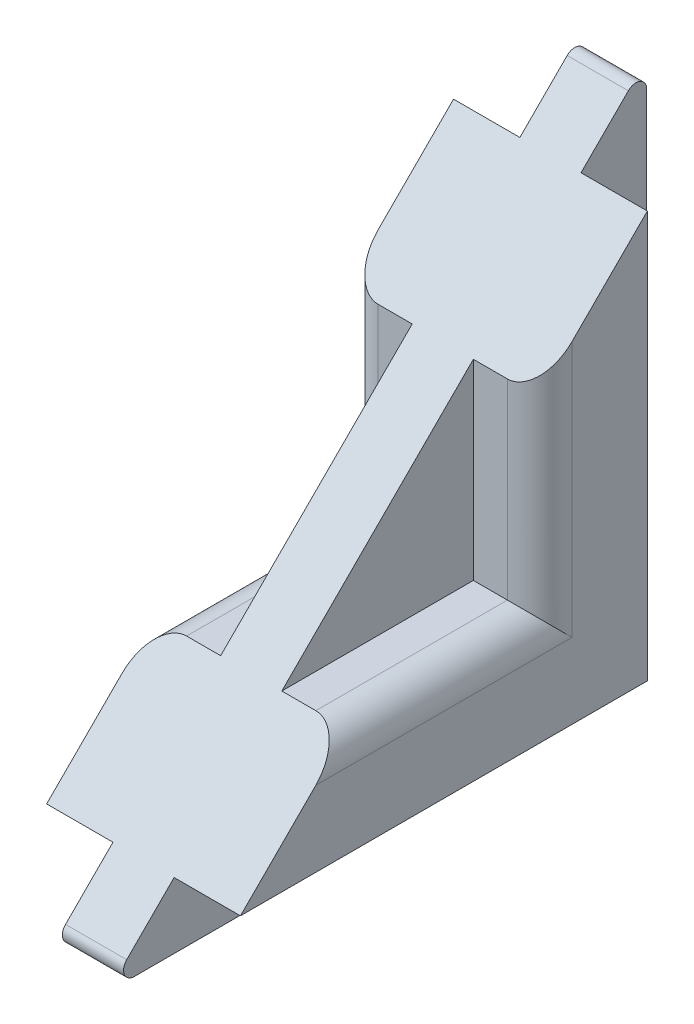
ISO-10303-21;
HEADER;
FILE_DESCRIPTION(('STEP AP214'),'2;1');
FILE_NAME('part.step','',(''),(''),'','','');
FILE_SCHEMA(('AUTOMOTIVE_DESIGN { 1 0 10303 214 1 1 1 1 }'));
ENDSEC;
DATA;
#1=APPLICATION_CONTEXT('core data for automotive mechanical design processes');
#2=APPLICATION_PROTOCOL_DEFINITION('international standard','automotive_design',2000,#1);
#3=PRODUCT_CONTEXT('',#1,'mechanical');
#4=PRODUCT('Part','Part','',(#3));
#5=PRODUCT_RELATED_PRODUCT_CATEGORY('part','',(#4));
#6=PRODUCT_DEFINITION_FORMATION('','',#4);
#7=PRODUCT_DEFINITION_CONTEXT('part definition',#1,'design');
#8=PRODUCT_DEFINITION('design','',#6,#7);
#9=PRODUCT_DEFINITION_SHAPE('','',#8);
#10=(LENGTH_UNIT() NAMED_UNIT(*) SI_UNIT(.MILLI.,.METRE.));
#11=(NAMED_UNIT(*) PLANE_ANGLE_UNIT() SI_UNIT($,.RADIAN.));
#12=(NAMED_UNIT(*) SI_UNIT($,.STERADIAN.) SOLID_ANGLE_UNIT());
#13=UNCERTAINTY_MEASURE_WITH_UNIT(LENGTH_MEASURE(1.E-05),#10,'distance_accuracy_value','');
#14=(GEOMETRIC_REPRESENTATION_CONTEXT(3) GLOBAL_UNCERTAINTY_ASSIGNED_CONTEXT((#13)) GLOBAL_UNIT_ASSIGNED_CONTEXT((#10,
#11,#12)) REPRESENTATION_CONTEXT('',''));
#15=CARTESIAN_POINT('',(0.,0.,0.));
#16=DIRECTION('',(0.,0.,1.));
#17=DIRECTION('',(1.,0.,0.));
#18=AXIS2_PLACEMENT_3D('',#15,#16,#17);
#19=CARTESIAN_POINT('',(-2.84,0.,0.));
#20=DIRECTION('',(1.,0.,0.));
#21=DIRECTION('',(0.,0.,-1.));
#22=AXIS2_PLACEMENT_3D('',#19,#20,#21);
#23=PLANE('',#22);
#24=DIRECTION('',(0.,0.707106781186548,-0.707106781186547));
#25=VECTOR('',#24,1.);
#26=CARTESIAN_POINT('',(-2.84,3.9,1.));
#27=LINE('',#26,#25);
#28=CARTESIAN_POINT('',(-2.84,47.8,-42.9));
#29=VERTEX_POINT('',#28);
#30=CARTESIAN_POINT('',(-2.84,52.1928932188134,-47.2928932188134));
#31=VERTEX_POINT('',#30);
#32=EDGE_CURVE('E231',#29,#31,#27,.T.);
#33=ORIENTED_EDGE('',*,*,#32,.T.);
#34=CARTESIAN_POINT('',(-2.84,51.4857864376269,-48.));
#35=DIRECTION('',(1.,0.,0.));
#36=DIRECTION('',(0.,0.,-1.));
#37=AXIS2_PLACEMENT_3D('',#34,#35,#36);
#38=CIRCLE('',#37,1.);
#39=CARTESIAN_POINT('',(-2.84,51.4857864376269,-49.));
#40=VERTEX_POINT('',#39);
#41=EDGE_CURVE('E311',#31,#40,#38,.F.);
#42=ORIENTED_EDGE('',*,*,#41,.T.);
#43=DIRECTION('',(0.,-1.,0.));
#44=VECTOR('',#43,1.);
#45=CARTESIAN_POINT('',(-2.84,53.9,-49.));
#46=LINE('',#45,#44);
#47=CARTESIAN_POINT('',(-2.84,10.0130093746648,-49.));
#48=VERTEX_POINT('',#47);
#49=EDGE_CURVE('E232',#40,#48,#46,.T.);
#50=ORIENTED_EDGE('',*,*,#49,.T.);
#51=DIRECTION('',(0.,0.,1.));
#52=VECTOR('',#51,1.);
#53=CARTESIAN_POINT('',(-2.84,10.0130093746648,-49.0001030776406));
#54=LINE('',#53,#52);
#55=CARTESIAN_POINT('',(-2.84,10.0130093746648,-42.9));
#56=VERTEX_POINT('',#55);
#57=EDGE_CURVE('E239',#48,#56,#54,.T.);
#58=ORIENTED_EDGE('',*,*,#57,.T.);
#59=DIRECTION('',(0.,-1.,0.));
#60=VECTOR('',#59,1.);
#61=CARTESIAN_POINT('',(-2.84,20.0130093746648,-42.9));
#62=LINE('',#61,#60);
#63=EDGE_CURVE('E271',#29,#56,#62,.T.);
#64=ORIENTED_EDGE('',*,*,#63,.F.);
#65=EDGE_LOOP('',(#33,#42,#50,#58,#64));
#66=FACE_BOUND('',#65,.T.);
#67=ADVANCED_FACE('F63',(#66),#23,.F.);
#68=CARTESIAN_POINT('',(2.84,0.,0.));
#69=DIRECTION('',(1.,0.,0.));
#70=DIRECTION('',(0.,0.,-1.));
#71=AXIS2_PLACEMENT_3D('',#68,#69,#70);
#72=PLANE('',#71);
#73=DIRECTION('',(0.,-1.,0.));
#74=VECTOR('',#73,1.);
#75=CARTESIAN_POINT('',(2.84,53.9,-49.));
#76=LINE('',#75,#74);
#77=CARTESIAN_POINT('',(2.84,51.4857864376269,-49.));
#78=VERTEX_POINT('',#77);
#79=CARTESIAN_POINT('',(2.84,10.0130093746648,-49.));
#80=VERTEX_POINT('',#79);
#81=EDGE_CURVE('E224',#78,#80,#76,.T.);
#82=ORIENTED_EDGE('',*,*,#81,.F.);
#83=CARTESIAN_POINT('',(2.84,51.4857864376269,-48.));
#84=DIRECTION('',(1.,0.,0.));
#85=DIRECTION('',(0.,0.,-1.));
#86=AXIS2_PLACEMENT_3D('',#83,#84,#85);
#87=CIRCLE('',#86,1.);
#88=CARTESIAN_POINT('',(2.84,52.1928932188134,-47.2928932188134));
#89=VERTEX_POINT('',#88);
#90=EDGE_CURVE('E314',#78,#89,#87,.T.);
#91=ORIENTED_EDGE('',*,*,#90,.T.);
#92=DIRECTION('',(0.,0.707106781186548,-0.707106781186547));
#93=VECTOR('',#92,1.);
#94=CARTESIAN_POINT('',(2.84,3.9,1.));
#95=LINE('',#94,#93);
#96=CARTESIAN_POINT('',(2.84,47.8,-42.9));
#97=VERTEX_POINT('',#96);
#98=EDGE_CURVE('E356',#97,#89,#95,.T.);
#99=ORIENTED_EDGE('',*,*,#98,.F.);
#100=DIRECTION('',(0.,1.,0.));
#101=VECTOR('',#100,1.);
#102=CARTESIAN_POINT('',(2.84,20.0130093746648,-42.9));
#103=LINE('',#102,#101);
#104=CARTESIAN_POINT('',(2.84,10.0130093746648,-42.9));
#105=VERTEX_POINT('',#104);
#106=EDGE_CURVE('E237',#105,#97,#103,.T.);
#107=ORIENTED_EDGE('',*,*,#106,.F.);
#108=DIRECTION('',(0.,0.,1.));
#109=VECTOR('',#108,1.);
#110=CARTESIAN_POINT('',(2.84,10.0130093746648,-49.0001030776406));
#111=LINE('',#110,#109);
#112=EDGE_CURVE('E214',#80,#105,#111,.T.);
#113=ORIENTED_EDGE('',*,*,#112,.F.);
#114=EDGE_LOOP('',(#82,#91,#99,#107,#113));
#115=FACE_BOUND('',#114,.T.);
#116=ADVANCED_FACE('F235',(#115),#72,.T.);
#117=CARTESIAN_POINT('',(9.00000000000001,20.0130093746648,14.7428405448833));
#118=DIRECTION('',(1.,0.,0.));
#119=DIRECTION('',(0.,0.,-1.));
#120=AXIS2_PLACEMENT_3D('',#117,#118,#119);
#121=PLANE('',#120);
#122=DIRECTION('',(0.,-0.707106781186548,0.707106781186547));
#123=VECTOR('',#122,1.);
#124=CARTESIAN_POINT('',(9.00000000000001,57.727924959774,-52.827924959774));
#125=LINE('',#124,#123);
#126=CARTESIAN_POINT('',(9.00000000000001,47.8,-42.9));
#127=VERTEX_POINT('',#126);
#128=CARTESIAN_POINT('',(9.00000000000001,40.8,-35.9));
#129=VERTEX_POINT('',#128);
#130=EDGE_CURVE('E252',#127,#129,#125,.T.);
#131=ORIENTED_EDGE('',*,*,#130,.T.);
#132=DIRECTION('',(0.,-1.,0.));
#133=VECTOR('',#132,1.);
#134=CARTESIAN_POINT('',(9.00000000000001,20.0130093746648,-35.9));
#135=LINE('',#134,#133);
#136=CARTESIAN_POINT('',(9.00000000000001,17.0130093746648,-35.9));
#137=VERTEX_POINT('',#136);
#138=EDGE_CURVE('E403',#129,#137,#135,.T.);
#139=ORIENTED_EDGE('',*,*,#138,.T.);
#140=DIRECTION('',(0.,0.,-1.));
#141=VECTOR('',#140,1.);
#142=CARTESIAN_POINT('',(9.00000000000001,17.0130093746648,14.7428405448833));
#143=LINE('',#142,#141);
#144=CARTESIAN_POINT('',(9.00000000000001,17.0130093746648,-12.1130093746648));
#145=VERTEX_POINT('',#144);
#146=EDGE_CURVE('E393',#137,#145,#143,.F.);
#147=ORIENTED_EDGE('',*,*,#146,.T.);
#148=DIRECTION('',(0.,-0.707106781186548,0.707106781186547));
#149=VECTOR('',#148,1.);
#150=CARTESIAN_POINT('',(9.00000000000001,5.08508441489075,-0.185084414890751));
#151=LINE('',#150,#149);
#152=CARTESIAN_POINT('',(9.00000000000001,10.0130093746648,-5.11300937466477));
#153=VERTEX_POINT('',#152);
#154=EDGE_CURVE('E288',#145,#153,#151,.T.);
#155=ORIENTED_EDGE('',*,*,#154,.T.);
#156=DIRECTION('',(0.,0.,-1.));
#157=VECTOR('',#156,1.);
#158=CARTESIAN_POINT('',(9.00000000000001,10.0130093746648,14.7428405448833));
#159=LINE('',#158,#157);
#160=CARTESIAN_POINT('',(9.00000000000001,10.0130093746648,-42.9));
#161=VERTEX_POINT('',#160);
#162=EDGE_CURVE('E290',#153,#161,#159,.T.);
#163=ORIENTED_EDGE('',*,*,#162,.T.);
#164=DIRECTION('',(0.,-1.,0.));
#165=VECTOR('',#164,1.);
#166=CARTESIAN_POINT('',(9.00000000000001,20.0130093746648,-42.9));
#167=LINE('',#166,#165);
#168=EDGE_CURVE('E272',#127,#161,#167,.T.);
#169=ORIENTED_EDGE('',*,*,#168,.F.);
#170=EDGE_LOOP('',(#131,#139,#147,#155,#163,#169));
#171=FACE_BOUND('',#170,.T.);
#172=ADVANCED_FACE('F456',(#171),#121,.T.);
#173=CARTESIAN_POINT('',(-9.,20.0130093746648,14.7428405448833));
#174=DIRECTION('',(0.,1.,0.));
#175=DIRECTION('',(-1.,0.,0.));
#176=AXIS2_PLACEMENT_3D('',#173,#174,#175);
#177=PLANE('',#176);
#178=DIRECTION('',(1.,0.,0.));
#179=VECTOR('',#178,1.);
#180=CARTESIAN_POINT('',(-8.99999999999999,20.0130093746648,-15.1130093746648));
#181=LINE('',#180,#179);
#182=CARTESIAN_POINT('',(2.84,20.0130093746648,-15.1130093746648));
#183=VERTEX_POINT('',#182);
#184=CARTESIAN_POINT('',(6.00000000000001,20.0130093746648,-15.1130093746648));
#185=VERTEX_POINT('',#184);
#186=EDGE_CURVE('E293',#183,#185,#181,.T.);
#187=ORIENTED_EDGE('',*,*,#186,.T.);
#188=DIRECTION('',(0.,0.,-1.));
#189=VECTOR('',#188,1.);
#190=CARTESIAN_POINT('',(6.00000000000001,20.0130093746648,14.7428405448833));
#191=LINE('',#190,#189);
#192=CARTESIAN_POINT('',(6.00000000000001,20.0130093746648,-32.9));
#193=VERTEX_POINT('',#192);
#194=EDGE_CURVE('E390',#185,#193,#191,.T.);
#195=ORIENTED_EDGE('',*,*,#194,.T.);
#196=DIRECTION('',(1.,0.,0.));
#197=VECTOR('',#196,1.);
#198=CARTESIAN_POINT('',(-9.,20.0130093746648,-32.9));
#199=LINE('',#198,#197);
#200=CARTESIAN_POINT('',(2.84,20.0130093746648,-32.9));
#201=VERTEX_POINT('',#200);
#202=EDGE_CURVE('E263',#201,#193,#199,.T.);
#203=ORIENTED_EDGE('',*,*,#202,.F.);
#204=DIRECTION('',(0.,0.,1.));
#205=VECTOR('',#204,1.);
#206=CARTESIAN_POINT('',(2.84,20.0130093746648,0.));
#207=LINE('',#206,#205);
#208=EDGE_CURVE('E299',#201,#183,#207,.T.);
#209=ORIENTED_EDGE('',*,*,#208,.T.);
#210=EDGE_LOOP('',(#187,#195,#203,#209));
#211=FACE_BOUND('',#210,.T.);
#212=ADVANCED_FACE('F482',(#211),#177,.T.);
#213=CARTESIAN_POINT('',(9.00000000000001,10.0130093746648,14.7428405448833));
#214=DIRECTION('',(0.,-1.,0.));
#215=DIRECTION('',(0.,0.,-1.));
#216=AXIS2_PLACEMENT_3D('',#213,#214,#215);
#217=PLANE('',#216);
#218=DIRECTION('',(0.,0.,-1.));
#219=VECTOR('',#218,1.);
#220=CARTESIAN_POINT('',(2.84,10.0130093746648,0.));
#221=LINE('',#220,#219);
#222=CARTESIAN_POINT('',(2.84,10.0130093746648,-5.11300937466477));
#223=VERTEX_POINT('',#222);
#224=EDGE_CURVE('E304',#223,#105,#221,.T.);
#225=ORIENTED_EDGE('',*,*,#224,.T.);
#226=DIRECTION('',(-1.,0.,0.));
#227=VECTOR('',#226,1.);
#228=CARTESIAN_POINT('',(9.,10.0130093746648,-42.9));
#229=LINE('',#228,#227);
#230=EDGE_CURVE('E275',#161,#105,#229,.T.);
#231=ORIENTED_EDGE('',*,*,#230,.F.);
#232=ORIENTED_EDGE('',*,*,#162,.F.);
#233=DIRECTION('',(-1.,0.,0.));
#234=VECTOR('',#233,1.);
#235=CARTESIAN_POINT('',(9.00000000000001,10.0130093746648,-5.11300937466477));
#236=LINE('',#235,#234);
#237=EDGE_CURVE('E284',#153,#223,#236,.T.);
#238=ORIENTED_EDGE('',*,*,#237,.T.);
#239=EDGE_LOOP('',(#225,#231,#232,#238));
#240=FACE_BOUND('',#239,.T.);
#241=ADVANCED_FACE('F485',(#240),#217,.T.);
#242=DIRECTION('',(0.,0.,-1.));
#243=VECTOR('',#242,1.);
#244=CARTESIAN_POINT('',(-9.,10.0130093746648,14.7428405448833));
#245=LINE('',#244,#243);
#246=CARTESIAN_POINT('',(-9.,10.0130093746648,-5.11300937466477));
#247=VERTEX_POINT('',#246);
#248=CARTESIAN_POINT('',(-9.,10.0130093746648,-42.9));
#249=VERTEX_POINT('',#248);
#250=EDGE_CURVE('E287',#247,#249,#245,.T.);
#251=ORIENTED_EDGE('',*,*,#250,.T.);
#252=DIRECTION('',(1.,0.,0.));
#253=VECTOR('',#252,1.);
#254=CARTESIAN_POINT('',(9.00000000000001,10.0130093746648,-42.9));
#255=LINE('',#254,#253);
#256=EDGE_CURVE('E278',#249,#56,#255,.T.);
#257=ORIENTED_EDGE('',*,*,#256,.T.);
#258=DIRECTION('',(0.,0.,-1.));
#259=VECTOR('',#258,1.);
#260=CARTESIAN_POINT('',(-2.84,10.0130093746648,0.));
#261=LINE('',#260,#259);
#262=CARTESIAN_POINT('',(-2.84,10.0130093746648,-5.11300937466477));
#263=VERTEX_POINT('',#262);
#264=EDGE_CURVE('E330',#263,#56,#261,.T.);
#265=ORIENTED_EDGE('',*,*,#264,.F.);
#266=EDGE_CURVE('E283',#263,#247,#236,.T.);
#267=ORIENTED_EDGE('',*,*,#266,.T.);
#268=EDGE_LOOP('',(#251,#257,#265,#267));
#269=FACE_BOUND('',#268,.T.);
#270=ADVANCED_FACE('F341',(#269),#217,.T.);
#271=DIRECTION('',(1.,0.,0.));
#272=VECTOR('',#271,1.);
#273=CARTESIAN_POINT('',(-9.,20.0130093746648,-32.9));
#274=LINE('',#273,#272);
#275=CARTESIAN_POINT('',(-6.,20.0130093746648,-32.9));
#276=VERTEX_POINT('',#275);
#277=CARTESIAN_POINT('',(-2.84,20.0130093746648,-32.9));
#278=VERTEX_POINT('',#277);
#279=EDGE_CURVE('E269',#276,#278,#274,.T.);
#280=ORIENTED_EDGE('',*,*,#279,.F.);
#281=DIRECTION('',(0.,0.,-1.));
#282=VECTOR('',#281,1.);
#283=CARTESIAN_POINT('',(-6.,20.0130093746648,14.7428405448833));
#284=LINE('',#283,#282);
#285=CARTESIAN_POINT('',(-6.,20.0130093746648,-15.1130093746648));
#286=VERTEX_POINT('',#285);
#287=EDGE_CURVE('E399',#276,#286,#284,.F.);
#288=ORIENTED_EDGE('',*,*,#287,.T.);
#289=CARTESIAN_POINT('',(-2.84,20.0130093746648,-15.1130093746648));
#290=VERTEX_POINT('',#289);
#291=EDGE_CURVE('E291',#286,#290,#181,.T.);
#292=ORIENTED_EDGE('',*,*,#291,.T.);
#293=DIRECTION('',(0.,0.,1.));
#294=VECTOR('',#293,1.);
#295=CARTESIAN_POINT('',(-2.84,20.0130093746648,0.));
#296=LINE('',#295,#294);
#297=EDGE_CURVE('E301',#278,#290,#296,.T.);
#298=ORIENTED_EDGE('',*,*,#297,.F.);
#299=EDGE_LOOP('',(#280,#288,#292,#298));
#300=FACE_BOUND('',#299,.T.);
#301=ADVANCED_FACE('F436',(#300),#177,.T.);
#302=CARTESIAN_POINT('',(-9.,10.0130093746648,14.7428405448833));
#303=DIRECTION('',(-1.,0.,0.));
#304=DIRECTION('',(0.,0.,1.));
#305=AXIS2_PLACEMENT_3D('',#302,#303,#304);
#306=PLANE('',#305);
#307=DIRECTION('',(0.,0.,-1.));
#308=VECTOR('',#307,1.);
#309=CARTESIAN_POINT('',(-9.,17.0130093746648,14.7428405448833));
#310=LINE('',#309,#308);
#311=CARTESIAN_POINT('',(-9.,17.0130093746648,-12.1130093746648));
#312=VERTEX_POINT('',#311);
#313=CARTESIAN_POINT('',(-9.,17.0130093746648,-35.9));
#314=VERTEX_POINT('',#313);
#315=EDGE_CURVE('E397',#312,#314,#310,.T.);
#316=ORIENTED_EDGE('',*,*,#315,.T.);
#317=DIRECTION('',(0.,-1.,0.));
#318=VECTOR('',#317,1.);
#319=CARTESIAN_POINT('',(-9.,10.0130093746648,-35.9));
#320=LINE('',#319,#318);
#321=CARTESIAN_POINT('',(-9.,40.8,-35.9));
#322=VERTEX_POINT('',#321);
#323=EDGE_CURVE('E415',#314,#322,#320,.F.);
#324=ORIENTED_EDGE('',*,*,#323,.T.);
#325=DIRECTION('',(0.,0.707106781186548,-0.707106781186547));
#326=VECTOR('',#325,1.);
#327=CARTESIAN_POINT('',(-9.,57.727924959774,-52.827924959774));
#328=LINE('',#327,#326);
#329=CARTESIAN_POINT('',(-9.,47.8,-42.9));
#330=VERTEX_POINT('',#329);
#331=EDGE_CURVE('E253',#322,#330,#328,.T.);
#332=ORIENTED_EDGE('',*,*,#331,.T.);
#333=DIRECTION('',(0.,-1.,0.));
#334=VECTOR('',#333,1.);
#335=CARTESIAN_POINT('',(-9.,10.0130093746648,-42.9));
#336=LINE('',#335,#334);
#337=EDGE_CURVE('E348',#330,#249,#336,.T.);
#338=ORIENTED_EDGE('',*,*,#337,.T.);
#339=ORIENTED_EDGE('',*,*,#250,.F.);
#340=DIRECTION('',(0.,0.707106781186548,-0.707106781186547));
#341=VECTOR('',#340,1.);
#342=CARTESIAN_POINT('',(-9.,0.0850844148907511,4.81491558510925));
#343=LINE('',#342,#341);
#344=EDGE_CURVE('E294',#247,#312,#343,.T.);
#345=ORIENTED_EDGE('',*,*,#344,.T.);
#346=EDGE_LOOP('',(#316,#324,#332,#338,#339,#345));
#347=FACE_BOUND('',#346,.T.);
#348=ADVANCED_FACE('F346',(#347),#306,.T.);
#349=CARTESIAN_POINT('',(-2.84,37.8,-32.9));
#350=VERTEX_POINT('',#349);
#351=EDGE_CURVE('E362',#290,#350,#27,.T.);
#352=ORIENTED_EDGE('',*,*,#351,.T.);
#353=DIRECTION('',(0.,-1.,0.));
#354=VECTOR('',#353,1.);
#355=CARTESIAN_POINT('',(-2.84,0.,-32.9));
#356=LINE('',#355,#354);
#357=EDGE_CURVE('E266',#350,#278,#356,.T.);
#358=ORIENTED_EDGE('',*,*,#357,.T.);
#359=ORIENTED_EDGE('',*,*,#297,.T.);
#360=EDGE_LOOP('',(#352,#358,#359));
#361=FACE_BOUND('',#360,.T.);
#362=ADVANCED_FACE('F434',(#361),#23,.F.);
#363=DIRECTION('',(0.,-1.,0.));
#364=VECTOR('',#363,1.);
#365=CARTESIAN_POINT('',(2.84,0.,-32.9));
#366=LINE('',#365,#364);
#367=CARTESIAN_POINT('',(2.84,37.8,-32.9));
#368=VERTEX_POINT('',#367);
#369=EDGE_CURVE('E255',#368,#201,#366,.T.);
#370=ORIENTED_EDGE('',*,*,#369,.F.);
#371=EDGE_CURVE('E351',#183,#368,#95,.T.);
#372=ORIENTED_EDGE('',*,*,#371,.F.);
#373=ORIENTED_EDGE('',*,*,#208,.F.);
#374=EDGE_LOOP('',(#370,#372,#373));
#375=FACE_BOUND('',#374,.T.);
#376=ADVANCED_FACE('F458',(#375),#72,.T.);
#377=CARTESIAN_POINT('',(2.84,53.9,-49.));
#378=DIRECTION('',(0.,0.,-1.));
#379=DIRECTION('',(-1.,0.,0.));
#380=AXIS2_PLACEMENT_3D('',#377,#378,#379);
#381=PLANE('',#380);
#382=DIRECTION('',(0.000107994562990206,0.999999994168587,0.));
#383=VECTOR('',#382,1.);
#384=CARTESIAN_POINT('',(2.8447395563459,53.8999994881537,-49.));
#385=LINE('',#384,#383);
#386=CARTESIAN_POINT('',(2.8394478227838,4.9,-49.));
#387=VERTEX_POINT('',#386);
#388=EDGE_CURVE('E210',#387,#80,#385,.T.);
#389=ORIENTED_EDGE('',*,*,#388,.F.);
#390=DIRECTION('',(-1.,0.,0.));
#391=VECTOR('',#390,1.);
#392=CARTESIAN_POINT('',(2.84,4.9,-49.));
#393=LINE('',#392,#391);
#394=CARTESIAN_POINT('',(-2.8394478227838,4.9,-49.));
#395=VERTEX_POINT('',#394);
#396=EDGE_CURVE('E323',#387,#395,#393,.T.);
#397=ORIENTED_EDGE('',*,*,#396,.T.);
#398=DIRECTION('',(0.000107994562990064,-0.999999994168587,0.));
#399=VECTOR('',#398,1.);
#400=CARTESIAN_POINT('',(-2.84473949010104,53.8993860790395,-49.));
#401=LINE('',#400,#399);
#402=EDGE_CURVE('E246',#48,#395,#401,.T.);
#403=ORIENTED_EDGE('',*,*,#402,.F.);
#404=ORIENTED_EDGE('',*,*,#49,.F.);
#405=DIRECTION('',(-1.,0.,0.));
#406=VECTOR('',#405,1.);
#407=CARTESIAN_POINT('',(2.84,51.4857864376269,-49.));
#408=LINE('',#407,#406);
#409=EDGE_CURVE('E228',#40,#78,#408,.F.);
#410=ORIENTED_EDGE('',*,*,#409,.T.);
#411=ORIENTED_EDGE('',*,*,#81,.T.);
#412=EDGE_LOOP('',(#389,#397,#403,#404,#410,#411));
#413=FACE_BOUND('',#412,.T.);
#414=ADVANCED_FACE('F225',(#413),#381,.T.);
#415=CARTESIAN_POINT('',(2.84,3.9,1.));
#416=DIRECTION('',(0.,0.707106781186547,0.707106781186548));
#417=DIRECTION('',(0.,-0.707106781186548,0.707106781186547));
#418=AXIS2_PLACEMENT_3D('',#415,#416,#417);
#419=PLANE('',#418);
#420=ORIENTED_EDGE('',*,*,#98,.T.);
#421=DIRECTION('',(-1.,0.,0.));
#422=VECTOR('',#421,1.);
#423=CARTESIAN_POINT('',(2.84,52.1928932188134,-47.2928932188134));
#424=LINE('',#423,#422);
#425=EDGE_CURVE('E376',#89,#31,#424,.T.);
#426=ORIENTED_EDGE('',*,*,#425,.T.);
#427=ORIENTED_EDGE('',*,*,#32,.F.);
#428=DIRECTION('',(1.,0.,0.));
#429=VECTOR('',#428,1.);
#430=CARTESIAN_POINT('',(-9.,47.8,-42.9));
#431=LINE('',#430,#429);
#432=EDGE_CURVE('E249',#330,#29,#431,.T.);
#433=ORIENTED_EDGE('',*,*,#432,.F.);
#434=ORIENTED_EDGE('',*,*,#331,.F.);
#435=CARTESIAN_POINT('',(-6.,40.8,-35.9));
#436=DIRECTION('',(0.,0.707106781186547,0.707106781186548));
#437=DIRECTION('',(0.,-0.707106781186548,0.707106781186547));
#438=AXIS2_PLACEMENT_3D('',#435,#436,#437);
#439=ELLIPSE('',#438,4.24264068711929,3.);
#440=CARTESIAN_POINT('',(-6.,37.8,-32.9));
#441=VERTEX_POINT('',#440);
#442=EDGE_CURVE('E408',#322,#441,#439,.T.);
#443=ORIENTED_EDGE('',*,*,#442,.T.);
#444=DIRECTION('',(-1.,0.,0.));
#445=VECTOR('',#444,1.);
#446=CARTESIAN_POINT('',(-9.,37.8,-32.9));
#447=LINE('',#446,#445);
#448=EDGE_CURVE('E258',#350,#441,#447,.T.);
#449=ORIENTED_EDGE('',*,*,#448,.F.);
#450=ORIENTED_EDGE('',*,*,#351,.F.);
#451=ORIENTED_EDGE('',*,*,#291,.F.);
#452=CARTESIAN_POINT('',(-6.,17.0130093746648,-12.1130093746648));
#453=DIRECTION('',(0.,0.707106781186547,0.707106781186548));
#454=DIRECTION('',(0.,0.707106781186548,-0.707106781186547));
#455=AXIS2_PLACEMENT_3D('',#452,#453,#454);
#456=ELLIPSE('',#455,4.24264068711928,3.);
#457=EDGE_CURVE('E401',#286,#312,#456,.T.);
#458=ORIENTED_EDGE('',*,*,#457,.T.);
#459=ORIENTED_EDGE('',*,*,#344,.F.);
#460=ORIENTED_EDGE('',*,*,#266,.F.);
#461=DIRECTION('',(-7.63636880442273E-05,0.707106779124832,-0.707106779124832));
#462=VECTOR('',#461,1.);
#463=CARTESIAN_POINT('',(-2.83933982822214,3.90000001824534,0.999999981754665));
#464=LINE('',#463,#462);
#465=CARTESIAN_POINT('',(-2.83952418647206,5.60710678118654,-0.70710678118654));
#466=VERTEX_POINT('',#465);
#467=EDGE_CURVE('E220',#466,#263,#464,.T.);
#468=ORIENTED_EDGE('',*,*,#467,.F.);
#469=DIRECTION('',(-1.,0.,0.));
#470=VECTOR('',#469,1.);
#471=CARTESIAN_POINT('',(2.84,5.60710678118654,-0.707106781186541));
#472=LINE('',#471,#470);
#473=CARTESIAN_POINT('',(2.83952418647207,5.60710678118654,-0.707106781186538));
#474=VERTEX_POINT('',#473);
#475=EDGE_CURVE('E381',#466,#474,#472,.F.);
#476=ORIENTED_EDGE('',*,*,#475,.T.);
#477=DIRECTION('',(-7.63636880443277E-05,-0.707106779124832,0.707106779124832));
#478=VECTOR('',#477,1.);
#479=CARTESIAN_POINT('',(2.84,10.0130093746648,-5.11300937466477));
#480=LINE('',#479,#478);
#481=EDGE_CURVE('E221',#223,#474,#480,.T.);
#482=ORIENTED_EDGE('',*,*,#481,.F.);
#483=ORIENTED_EDGE('',*,*,#237,.F.);
#484=ORIENTED_EDGE('',*,*,#154,.F.);
#485=CARTESIAN_POINT('',(6.00000000000001,17.0130093746648,-12.1130093746648));
#486=DIRECTION('',(0.,0.707106781186547,0.707106781186548));
#487=DIRECTION('',(0.,0.707106781186548,-0.707106781186547));
#488=AXIS2_PLACEMENT_3D('',#485,#486,#487);
#489=ELLIPSE('',#488,4.24264068711928,3.);
#490=EDGE_CURVE('E395',#145,#185,#489,.T.);
#491=ORIENTED_EDGE('',*,*,#490,.T.);
#492=ORIENTED_EDGE('',*,*,#186,.F.);
#493=ORIENTED_EDGE('',*,*,#371,.T.);
#494=CARTESIAN_POINT('',(6.,37.8,-32.9));
#495=VERTEX_POINT('',#494);
#496=EDGE_CURVE('E256',#495,#368,#447,.T.);
#497=ORIENTED_EDGE('',*,*,#496,.F.);
#498=CARTESIAN_POINT('',(6.,40.8,-35.9));
#499=DIRECTION('',(0.,0.707106781186547,0.707106781186548));
#500=DIRECTION('',(0.,-0.707106781186548,0.707106781186547));
#501=AXIS2_PLACEMENT_3D('',#498,#499,#500);
#502=ELLIPSE('',#501,4.24264068711929,3.);
#503=EDGE_CURVE('E410',#495,#129,#502,.T.);
#504=ORIENTED_EDGE('',*,*,#503,.T.);
#505=ORIENTED_EDGE('',*,*,#130,.F.);
#506=EDGE_CURVE('E248',#97,#127,#431,.T.);
#507=ORIENTED_EDGE('',*,*,#506,.F.);
#508=EDGE_LOOP('',(#420,#426,#427,#433,#434,#443,#449,#450,#451,#458,#459,#460,#468,#476,#482,
#483,#484,#491,#492,#493,#497,#504,#505,#507));
#509=FACE_BOUND('',#508,.T.);
#510=ADVANCED_FACE('F375',(#509),#419,.T.);
#511=CARTESIAN_POINT('',(2.84,3.9,-49.));
#512=DIRECTION('',(0.,-1.,0.));
#513=DIRECTION('',(0.,0.,-1.));
#514=AXIS2_PLACEMENT_3D('',#511,#512,#513);
#515=PLANE('',#514);
#516=DIRECTION('',(0.,0.,1.));
#517=VECTOR('',#516,1.);
#518=CARTESIAN_POINT('',(-2.83933982822017,3.9,-49.));
#519=LINE('',#518,#517);
#520=CARTESIAN_POINT('',(-2.83933982822017,3.9,-48.));
#521=VERTEX_POINT('',#520);
#522=CARTESIAN_POINT('',(-2.83933982822017,3.9,-1.41421356237308));
#523=VERTEX_POINT('',#522);
#524=EDGE_CURVE('E353',#521,#523,#519,.T.);
#525=ORIENTED_EDGE('',*,*,#524,.F.);
#526=DIRECTION('',(-1.,0.,0.));
#527=VECTOR('',#526,1.);
#528=CARTESIAN_POINT('',(2.84,3.9,-48.));
#529=LINE('',#528,#527);
#530=CARTESIAN_POINT('',(2.83933982822018,3.9,-48.));
#531=VERTEX_POINT('',#530);
#532=EDGE_CURVE('E71',#521,#531,#529,.F.);
#533=ORIENTED_EDGE('',*,*,#532,.T.);
#534=DIRECTION('',(0.,0.,-1.));
#535=VECTOR('',#534,1.);
#536=CARTESIAN_POINT('',(2.83933982822018,3.9,-49.));
#537=LINE('',#536,#535);
#538=CARTESIAN_POINT('',(2.83933982822018,3.9,-1.41421356237308));
#539=VERTEX_POINT('',#538);
#540=EDGE_CURVE('E350',#539,#531,#537,.T.);
#541=ORIENTED_EDGE('',*,*,#540,.F.);
#542=DIRECTION('',(-1.,0.,0.));
#543=VECTOR('',#542,1.);
#544=CARTESIAN_POINT('',(2.84,3.9,-1.41421356237308));
#545=LINE('',#544,#543);
#546=EDGE_CURVE('E316',#539,#523,#545,.T.);
#547=ORIENTED_EDGE('',*,*,#546,.T.);
#548=EDGE_LOOP('',(#525,#533,#541,#547));
#549=FACE_BOUND('',#548,.T.);
#550=ADVANCED_FACE('F446',(#549),#515,.T.);
#551=CARTESIAN_POINT('',(0.,0.,-42.9));
#552=DIRECTION('',(0.,0.,-1.));
#553=DIRECTION('',(-1.,0.,0.));
#554=AXIS2_PLACEMENT_3D('',#551,#552,#553);
#555=PLANE('',#554);
#556=ORIENTED_EDGE('',*,*,#337,.F.);
#557=ORIENTED_EDGE('',*,*,#432,.T.);
#558=ORIENTED_EDGE('',*,*,#63,.T.);
#559=ORIENTED_EDGE('',*,*,#256,.F.);
#560=EDGE_LOOP('',(#556,#557,#558,#559));
#561=FACE_BOUND('',#560,.T.);
#562=ADVANCED_FACE('F336',(#561),#555,.T.);
#563=CARTESIAN_POINT('',(0.,0.,-42.9));
#564=DIRECTION('',(0.,0.,-1.));
#565=DIRECTION('',(-1.,0.,0.));
#566=AXIS2_PLACEMENT_3D('',#563,#564,#565);
#567=PLANE('',#566);
#568=ORIENTED_EDGE('',*,*,#168,.T.);
#569=ORIENTED_EDGE('',*,*,#230,.T.);
#570=ORIENTED_EDGE('',*,*,#106,.T.);
#571=ORIENTED_EDGE('',*,*,#506,.T.);
#572=EDGE_LOOP('',(#568,#569,#570,#571));
#573=FACE_BOUND('',#572,.T.);
#574=ADVANCED_FACE('F468',(#573),#567,.T.);
#575=CARTESIAN_POINT('',(-9.,67.655849919548,-32.9));
#576=DIRECTION('',(0.,0.,1.));
#577=DIRECTION('',(1.,0.,0.));
#578=AXIS2_PLACEMENT_3D('',#575,#576,#577);
#579=PLANE('',#578);
#580=ORIENTED_EDGE('',*,*,#202,.T.);
#581=DIRECTION('',(0.,-1.,0.));
#582=VECTOR('',#581,1.);
#583=CARTESIAN_POINT('',(6.,67.655849919548,-32.9));
#584=LINE('',#583,#582);
#585=EDGE_CURVE('E406',#193,#495,#584,.F.);
#586=ORIENTED_EDGE('',*,*,#585,.T.);
#587=ORIENTED_EDGE('',*,*,#496,.T.);
#588=ORIENTED_EDGE('',*,*,#369,.T.);
#589=EDGE_LOOP('',(#580,#586,#587,#588));
#590=FACE_BOUND('',#589,.T.);
#591=ADVANCED_FACE('F474',(#590),#579,.T.);
#592=ORIENTED_EDGE('',*,*,#448,.T.);
#593=DIRECTION('',(0.,-1.,0.));
#594=VECTOR('',#593,1.);
#595=CARTESIAN_POINT('',(-6.,67.655849919548,-32.9));
#596=LINE('',#595,#594);
#597=EDGE_CURVE('E412',#441,#276,#596,.T.);
#598=ORIENTED_EDGE('',*,*,#597,.T.);
#599=ORIENTED_EDGE('',*,*,#279,.T.);
#600=ORIENTED_EDGE('',*,*,#357,.F.);
#601=EDGE_LOOP('',(#592,#598,#599,#600));
#602=FACE_BOUND('',#601,.T.);
#603=ADVANCED_FACE('F431',(#602),#579,.T.);
#604=CARTESIAN_POINT('',(2.83933982822018,3.9,-49.0001030776406));
#605=DIRECTION('',(-0.999999994168587,0.000107994562990206,0.));
#606=DIRECTION('',(-0.000107994562990206,-0.999999994168587,0.));
#607=AXIS2_PLACEMENT_3D('',#604,#605,#606);
#608=PLANE('',#607);
#609=ORIENTED_EDGE('',*,*,#540,.T.);
#610=CARTESIAN_POINT('',(2.8394478227838,4.9,-48.));
#611=DIRECTION('',(-0.999999994168587,0.000107994562990206,0.));
#612=DIRECTION('',(-0.000107994562990206,-0.999999994168587,0.));
#613=AXIS2_PLACEMENT_3D('',#610,#611,#612);
#614=ELLIPSE('',#613,1.00000000583141,1.);
#615=EDGE_CURVE('E12',#531,#387,#614,.F.);
#616=ORIENTED_EDGE('',*,*,#615,.T.);
#617=ORIENTED_EDGE('',*,*,#388,.T.);
#618=ORIENTED_EDGE('',*,*,#112,.T.);
#619=ORIENTED_EDGE('',*,*,#224,.F.);
#620=ORIENTED_EDGE('',*,*,#481,.T.);
#621=CARTESIAN_POINT('',(2.8394478227838,4.9,-1.41421356237308));
#622=DIRECTION('',(-0.999999994168587,0.000107994562990206,0.));
#623=DIRECTION('',(-0.000107994562990206,-0.999999994168587,0.));
#624=AXIS2_PLACEMENT_3D('',#621,#622,#623);
#625=ELLIPSE('',#624,1.00000000583141,1.);
#626=EDGE_CURVE('E321',#474,#539,#625,.F.);
#627=ORIENTED_EDGE('',*,*,#626,.T.);
#628=EDGE_LOOP('',(#609,#616,#617,#618,#619,#620,#627));
#629=FACE_BOUND('',#628,.T.);
#630=ADVANCED_FACE('F212',(#629),#608,.F.);
#631=CARTESIAN_POINT('',(-2.84,10.0130093746648,-49.0001030776406));
#632=DIRECTION('',(0.999999994168587,0.000107994562990064,0.));
#633=DIRECTION('',(-0.000107994562990064,0.999999994168587,0.));
#634=AXIS2_PLACEMENT_3D('',#631,#632,#633);
#635=PLANE('',#634);
#636=ORIENTED_EDGE('',*,*,#402,.T.);
#637=CARTESIAN_POINT('',(-2.83944782278379,4.9,-48.));
#638=DIRECTION('',(0.999999994168587,0.000107994562990064,0.));
#639=DIRECTION('',(-0.000107994562990064,0.999999994168587,0.));
#640=AXIS2_PLACEMENT_3D('',#637,#638,#639);
#641=ELLIPSE('',#640,1.00000000583141,1.);
#642=EDGE_CURVE('E85',#395,#521,#641,.F.);
#643=ORIENTED_EDGE('',*,*,#642,.T.);
#644=ORIENTED_EDGE('',*,*,#524,.T.);
#645=CARTESIAN_POINT('',(-2.83944782278379,4.9,-1.41421356237308));
#646=DIRECTION('',(0.999999994168587,0.000107994562990064,0.));
#647=DIRECTION('',(-0.000107994562990064,0.999999994168587,0.));
#648=AXIS2_PLACEMENT_3D('',#645,#646,#647);
#649=ELLIPSE('',#648,1.00000000583141,1.);
#650=EDGE_CURVE('E319',#523,#466,#649,.F.);
#651=ORIENTED_EDGE('',*,*,#650,.T.);
#652=ORIENTED_EDGE('',*,*,#467,.T.);
#653=ORIENTED_EDGE('',*,*,#264,.T.);
#654=ORIENTED_EDGE('',*,*,#57,.F.);
#655=EDGE_LOOP('',(#636,#643,#644,#651,#652,#653,#654));
#656=FACE_BOUND('',#655,.T.);
#657=ADVANCED_FACE('F328',(#656),#635,.F.);
#658=CARTESIAN_POINT('',(6.00000000000001,17.0130093746648,14.7428405448833));
#659=DIRECTION('',(0.,0.,-1.));
#660=DIRECTION('',(-1.,0.,0.));
#661=AXIS2_PLACEMENT_3D('',#658,#659,#660);
#662=CYLINDRICAL_SURFACE('',#661,3.);
#663=ORIENTED_EDGE('',*,*,#490,.F.);
#664=ORIENTED_EDGE('',*,*,#146,.F.);
#665=CARTESIAN_POINT('',(6.00000000000001,17.0130093746648,-35.9));
#666=DIRECTION('',(0.,-0.707106781186547,0.707106781186547));
#667=DIRECTION('',(0.,-0.707106781186547,-0.707106781186547));
#668=AXIS2_PLACEMENT_3D('',#665,#666,#667);
#669=ELLIPSE('',#668,4.24264068711928,3.);
#670=EDGE_CURVE('E417',#137,#193,#669,.T.);
#671=ORIENTED_EDGE('',*,*,#670,.T.);
#672=ORIENTED_EDGE('',*,*,#194,.F.);
#673=EDGE_LOOP('',(#663,#664,#671,#672));
#674=FACE_BOUND('',#673,.T.);
#675=ADVANCED_FACE('F528',(#674),#662,.T.);
#676=CARTESIAN_POINT('',(-6.,17.0130093746648,14.7428405448833));
#677=DIRECTION('',(0.,0.,-1.));
#678=DIRECTION('',(-1.,0.,0.));
#679=AXIS2_PLACEMENT_3D('',#676,#677,#678);
#680=CYLINDRICAL_SURFACE('',#679,3.);
#681=ORIENTED_EDGE('',*,*,#457,.F.);
#682=ORIENTED_EDGE('',*,*,#287,.F.);
#683=CARTESIAN_POINT('',(-6.,17.0130093746648,-35.9));
#684=DIRECTION('',(0.,-0.707106781186547,0.707106781186547));
#685=DIRECTION('',(0.,-0.707106781186547,-0.707106781186547));
#686=AXIS2_PLACEMENT_3D('',#683,#684,#685);
#687=ELLIPSE('',#686,4.24264068711928,3.);
#688=EDGE_CURVE('E383',#276,#314,#687,.T.);
#689=ORIENTED_EDGE('',*,*,#688,.T.);
#690=ORIENTED_EDGE('',*,*,#315,.F.);
#691=EDGE_LOOP('',(#681,#682,#689,#690));
#692=FACE_BOUND('',#691,.T.);
#693=ADVANCED_FACE('F423',(#692),#680,.T.);
#694=CARTESIAN_POINT('',(6.,20.0130093746648,-35.9));
#695=DIRECTION('',(0.,-1.,0.));
#696=DIRECTION('',(0.,0.,-1.));
#697=AXIS2_PLACEMENT_3D('',#694,#695,#696);
#698=CYLINDRICAL_SURFACE('',#697,3.);
#699=ORIENTED_EDGE('',*,*,#503,.F.);
#700=ORIENTED_EDGE('',*,*,#585,.F.);
#701=ORIENTED_EDGE('',*,*,#670,.F.);
#702=ORIENTED_EDGE('',*,*,#138,.F.);
#703=EDGE_LOOP('',(#699,#700,#701,#702));
#704=FACE_BOUND('',#703,.T.);
#705=ADVANCED_FACE('F563',(#704),#698,.T.);
#706=CARTESIAN_POINT('',(-6.,67.655849919548,-35.9));
#707=DIRECTION('',(0.,-1.,0.));
#708=DIRECTION('',(0.,0.,-1.));
#709=AXIS2_PLACEMENT_3D('',#706,#707,#708);
#710=CYLINDRICAL_SURFACE('',#709,3.);
#711=ORIENTED_EDGE('',*,*,#442,.F.);
#712=ORIENTED_EDGE('',*,*,#323,.F.);
#713=ORIENTED_EDGE('',*,*,#688,.F.);
#714=ORIENTED_EDGE('',*,*,#597,.F.);
#715=EDGE_LOOP('',(#711,#712,#713,#714));
#716=FACE_BOUND('',#715,.T.);
#717=ADVANCED_FACE('F427',(#716),#710,.T.);
#718=CARTESIAN_POINT('',(2.84,51.4857864376269,-48.));
#719=DIRECTION('',(-1.,0.,0.));
#720=DIRECTION('',(0.,0.,1.));
#721=AXIS2_PLACEMENT_3D('',#718,#719,#720);
#722=CYLINDRICAL_SURFACE('',#721,1.);
#723=ORIENTED_EDGE('',*,*,#90,.F.);
#724=ORIENTED_EDGE('',*,*,#409,.F.);
#725=ORIENTED_EDGE('',*,*,#41,.F.);
#726=ORIENTED_EDGE('',*,*,#425,.F.);
#727=EDGE_LOOP('',(#723,#724,#725,#726));
#728=FACE_BOUND('',#727,.T.);
#729=ADVANCED_FACE('F380',(#728),#722,.T.);
#730=CARTESIAN_POINT('',(2.84,4.9,-1.41421356237308));
#731=DIRECTION('',(-1.,0.,0.));
#732=DIRECTION('',(0.,0.,1.));
#733=AXIS2_PLACEMENT_3D('',#730,#731,#732);
#734=CYLINDRICAL_SURFACE('',#733,1.);
#735=ORIENTED_EDGE('',*,*,#626,.F.);
#736=ORIENTED_EDGE('',*,*,#475,.F.);
#737=ORIENTED_EDGE('',*,*,#650,.F.);
#738=ORIENTED_EDGE('',*,*,#546,.F.);
#739=EDGE_LOOP('',(#735,#736,#737,#738));
#740=FACE_BOUND('',#739,.T.);
#741=ADVANCED_FACE('F444',(#740),#734,.T.);
#742=CARTESIAN_POINT('',(2.84,4.9,-48.));
#743=DIRECTION('',(-1.,0.,0.));
#744=DIRECTION('',(0.,0.,1.));
#745=AXIS2_PLACEMENT_3D('',#742,#743,#744);
#746=CYLINDRICAL_SURFACE('',#745,1.);
#747=ORIENTED_EDGE('',*,*,#615,.F.);
#748=ORIENTED_EDGE('',*,*,#532,.F.);
#749=ORIENTED_EDGE('',*,*,#642,.F.);
#750=ORIENTED_EDGE('',*,*,#396,.F.);
#751=EDGE_LOOP('',(#747,#748,#749,#750));
#752=FACE_BOUND('',#751,.T.);
#753=ADVANCED_FACE('F65',(#752),#746,.T.);
#754=CLOSED_SHELL('',(#67,#116,#172,#212,#241,#270,#301,#348,#362,#376,#414,#510,#550,#562,#574,
#591,#603,#630,#657,#675,#693,#705,#717,#729,#741,#753));
#755=MANIFOLD_SOLID_BREP('B2',#754);
#756=ADVANCED_BREP_SHAPE_REPRESENTATION('',(#18,#755),#14);
#757=SHAPE_DEFINITION_REPRESENTATION(#9,#756);
ENDSEC;
END-ISO-10303-21;
